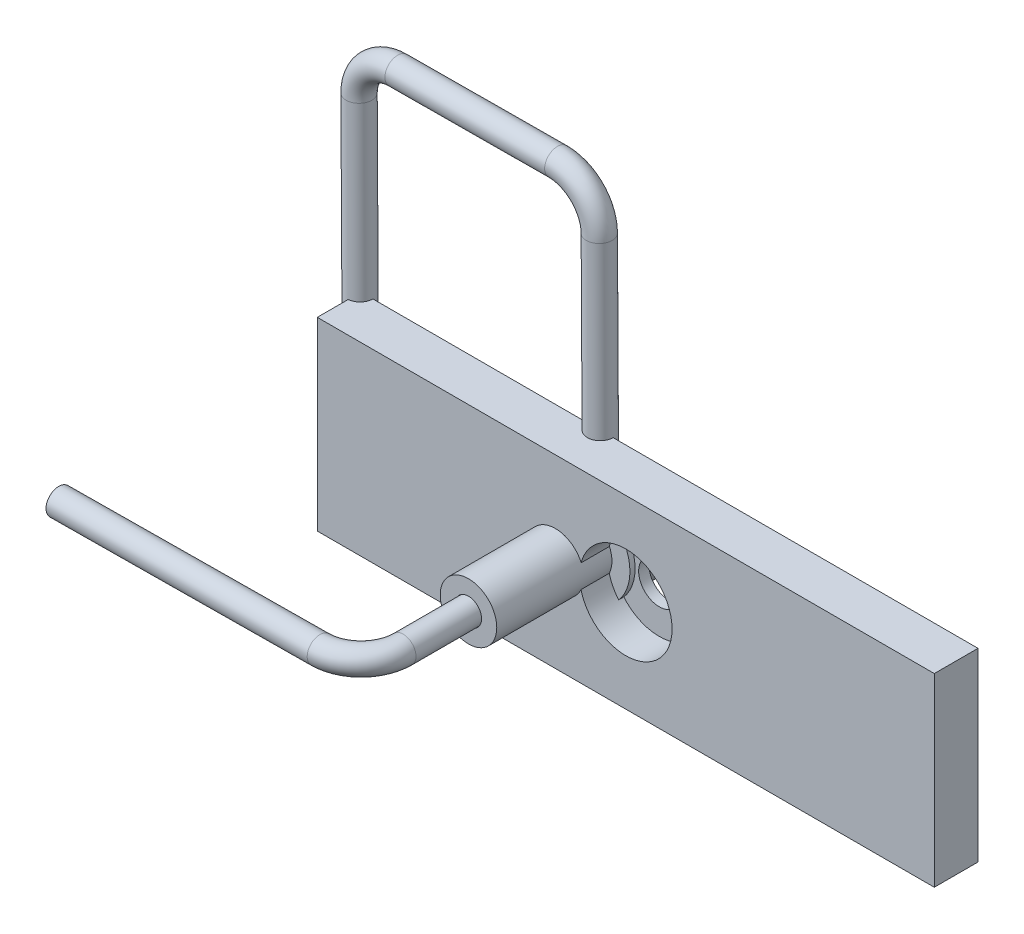
ISO-10303-21;
HEADER;
FILE_DESCRIPTION(('STEP AP214'),'2;1');
FILE_NAME('part.step','',(''),(''),'','','');
FILE_SCHEMA(('AUTOMOTIVE_DESIGN { 1 0 10303 214 1 1 1 1 }'));
ENDSEC;
DATA;
#1=APPLICATION_CONTEXT('core data for automotive mechanical design processes');
#2=APPLICATION_PROTOCOL_DEFINITION('international standard','automotive_design',2000,#1);
#3=PRODUCT_CONTEXT('',#1,'mechanical');
#4=PRODUCT('Part','Part','',(#3));
#5=PRODUCT_RELATED_PRODUCT_CATEGORY('part','',(#4));
#6=PRODUCT_DEFINITION_FORMATION('','',#4);
#7=PRODUCT_DEFINITION_CONTEXT('part definition',#1,'design');
#8=PRODUCT_DEFINITION('design','',#6,#7);
#9=PRODUCT_DEFINITION_SHAPE('','',#8);
#10=(LENGTH_UNIT() NAMED_UNIT(*) SI_UNIT(.MILLI.,.METRE.));
#11=(NAMED_UNIT(*) PLANE_ANGLE_UNIT() SI_UNIT($,.RADIAN.));
#12=(NAMED_UNIT(*) SI_UNIT($,.STERADIAN.) SOLID_ANGLE_UNIT());
#13=UNCERTAINTY_MEASURE_WITH_UNIT(LENGTH_MEASURE(1.E-05),#10,'distance_accuracy_value','');
#14=(GEOMETRIC_REPRESENTATION_CONTEXT(3) GLOBAL_UNCERTAINTY_ASSIGNED_CONTEXT((#13)) GLOBAL_UNIT_ASSIGNED_CONTEXT((#10,
#11,#12)) REPRESENTATION_CONTEXT('',''));
#15=CARTESIAN_POINT('',(0.,0.,0.));
#16=DIRECTION('',(0.,0.,1.));
#17=DIRECTION('',(1.,0.,0.));
#18=AXIS2_PLACEMENT_3D('',#15,#16,#17);
#19=CARTESIAN_POINT('',(0.,0.,18.));
#20=DIRECTION('',(0.,0.,1.));
#21=DIRECTION('',(1.,0.,0.));
#22=AXIS2_PLACEMENT_3D('',#19,#20,#21);
#23=PLANE('',#22);
#24=CARTESIAN_POINT('',(0.,0.,18.));
#25=DIRECTION('',(0.,0.,1.));
#26=DIRECTION('',(1.,0.,0.));
#27=AXIS2_PLACEMENT_3D('',#24,#25,#26);
#28=CIRCLE('',#27,5.);
#29=CARTESIAN_POINT('',(5.,0.,18.));
#30=VERTEX_POINT('',#29);
#31=EDGE_CURVE('E13',#30,#30,#28,.T.);
#32=ORIENTED_EDGE('',*,*,#31,.T.);
#33=EDGE_LOOP('',(#32));
#34=FACE_BOUND('',#33,.T.);
#35=CARTESIAN_POINT('',(0.,0.,18.));
#36=DIRECTION('',(0.,0.,1.));
#37=DIRECTION('',(1.,0.,0.));
#38=AXIS2_PLACEMENT_3D('',#35,#36,#37);
#39=CIRCLE('',#38,2.55);
#40=CARTESIAN_POINT('',(2.55,0.,18.));
#41=VERTEX_POINT('',#40);
#42=EDGE_CURVE('E159',#41,#41,#39,.T.);
#43=ORIENTED_EDGE('',*,*,#42,.F.);
#44=EDGE_LOOP('',(#43));
#45=FACE_BOUND('',#44,.T.);
#46=ADVANCED_FACE('F148',(#34,#45),#23,.T.);
#47=CARTESIAN_POINT('',(0.,0.,0.));
#48=DIRECTION('',(0.,0.,1.));
#49=DIRECTION('',(1.,0.,0.));
#50=AXIS2_PLACEMENT_3D('',#47,#48,#49);
#51=PLANE('',#50);
#52=CARTESIAN_POINT('',(0.,0.,0.));
#53=DIRECTION('',(0.,0.,1.));
#54=DIRECTION('',(1.,0.,0.));
#55=AXIS2_PLACEMENT_3D('',#52,#53,#54);
#56=CIRCLE('',#55,5.);
#57=CARTESIAN_POINT('',(5.,0.,0.));
#58=VERTEX_POINT('',#57);
#59=EDGE_CURVE('E152',#58,#58,#56,.T.);
#60=ORIENTED_EDGE('',*,*,#59,.F.);
#61=EDGE_LOOP('',(#60));
#62=FACE_BOUND('',#61,.T.);
#63=CARTESIAN_POINT('',(0.,0.,0.));
#64=DIRECTION('',(0.,0.,1.));
#65=DIRECTION('',(1.,0.,0.));
#66=AXIS2_PLACEMENT_3D('',#63,#64,#65);
#67=CIRCLE('',#66,2.55);
#68=CARTESIAN_POINT('',(2.55,0.,0.));
#69=VERTEX_POINT('',#68);
#70=EDGE_CURVE('E161',#69,#69,#67,.T.);
#71=ORIENTED_EDGE('',*,*,#70,.T.);
#72=EDGE_LOOP('',(#71));
#73=FACE_BOUND('',#72,.T.);
#74=ADVANCED_FACE('F171',(#62,#73),#51,.F.);
#75=CARTESIAN_POINT('',(0.,0.,18.));
#76=DIRECTION('',(0.,0.,-1.));
#77=DIRECTION('',(-1.,0.,0.));
#78=AXIS2_PLACEMENT_3D('',#75,#76,#77);
#79=CYLINDRICAL_SURFACE('',#78,5.);
#80=ORIENTED_EDGE('',*,*,#31,.F.);
#81=EDGE_LOOP('',(#80));
#82=FACE_BOUND('',#81,.T.);
#83=ORIENTED_EDGE('',*,*,#59,.T.);
#84=EDGE_LOOP('',(#83));
#85=FACE_BOUND('',#84,.T.);
#86=ADVANCED_FACE('F150',(#82,#85),#79,.T.);
#87=CARTESIAN_POINT('',(0.,0.,18.));
#88=DIRECTION('',(0.,0.,-1.));
#89=DIRECTION('',(-1.,0.,0.));
#90=AXIS2_PLACEMENT_3D('',#87,#88,#89);
#91=CYLINDRICAL_SURFACE('',#90,2.55);
#92=ORIENTED_EDGE('',*,*,#42,.T.);
#93=EDGE_LOOP('',(#92));
#94=FACE_BOUND('',#93,.T.);
#95=ORIENTED_EDGE('',*,*,#70,.F.);
#96=EDGE_LOOP('',(#95));
#97=FACE_BOUND('',#96,.T.);
#98=ADVANCED_FACE('F167',(#94,#97),#91,.F.);
#99=CLOSED_SHELL('',(#46,#74,#86,#98));
#100=MANIFOLD_SOLID_BREP('B2',#99);
#101=CARTESIAN_POINT('',(73.694582367874,0.,8.5));
#102=DIRECTION('',(-1.,0.,0.));
#103=DIRECTION('',(0.,0.,1.));
#104=AXIS2_PLACEMENT_3D('',#101,#102,#103);
#105=PLANE('',#104);
#106=DIRECTION('',(0.,1.,0.));
#107=VECTOR('',#106,1.);
#108=CARTESIAN_POINT('',(73.694582367874,0.,0.));
#109=LINE('',#108,#107);
#110=CARTESIAN_POINT('',(73.694582367874,-18.0858213584229,0.));
#111=VERTEX_POINT('',#110);
#112=CARTESIAN_POINT('',(73.694582367874,17.9141786415771,0.));
#113=VERTEX_POINT('',#112);
#114=EDGE_CURVE('E287',#111,#113,#109,.T.);
#115=ORIENTED_EDGE('',*,*,#114,.T.);
#116=DIRECTION('',(0.,0.,-1.));
#117=VECTOR('',#116,1.);
#118=CARTESIAN_POINT('',(73.694582367874,17.9141786415771,8.5));
#119=LINE('',#118,#117);
#120=CARTESIAN_POINT('',(73.694582367874,17.9141786415771,8.5));
#121=VERTEX_POINT('',#120);
#122=EDGE_CURVE('E225',#121,#113,#119,.T.);
#123=ORIENTED_EDGE('',*,*,#122,.F.);
#124=DIRECTION('',(0.,1.,0.));
#125=VECTOR('',#124,1.);
#126=CARTESIAN_POINT('',(73.694582367874,0.,8.5));
#127=LINE('',#126,#125);
#128=CARTESIAN_POINT('',(73.694582367874,-18.0858213584229,8.5));
#129=VERTEX_POINT('',#128);
#130=EDGE_CURVE('E258',#129,#121,#127,.T.);
#131=ORIENTED_EDGE('',*,*,#130,.F.);
#132=DIRECTION('',(0.,0.,-1.));
#133=VECTOR('',#132,1.);
#134=CARTESIAN_POINT('',(73.694582367874,-18.0858213584229,8.5));
#135=LINE('',#134,#133);
#136=EDGE_CURVE('E233',#129,#111,#135,.T.);
#137=ORIENTED_EDGE('',*,*,#136,.T.);
#138=EDGE_LOOP('',(#115,#123,#131,#137));
#139=FACE_BOUND('',#138,.T.);
#140=ADVANCED_FACE('F217',(#139),#105,.F.);
#141=CARTESIAN_POINT('',(0.,17.9141786415771,8.5));
#142=DIRECTION('',(0.,1.,0.));
#143=DIRECTION('',(0.,0.,1.));
#144=AXIS2_PLACEMENT_3D('',#141,#142,#143);
#145=PLANE('',#144);
#146=DIRECTION('',(1.,0.,0.));
#147=VECTOR('',#146,1.);
#148=CARTESIAN_POINT('',(0.,17.9141786415771,0.));
#149=LINE('',#148,#147);
#150=CARTESIAN_POINT('',(-46.305417632126,17.9141786415771,0.));
#151=VERTEX_POINT('',#150);
#152=EDGE_CURVE('E268',#151,#113,#149,.T.);
#153=ORIENTED_EDGE('',*,*,#152,.F.);
#154=DIRECTION('',(0.,0.,-1.));
#155=VECTOR('',#154,1.);
#156=CARTESIAN_POINT('',(-46.305417632126,17.9141786415771,8.5));
#157=LINE('',#156,#155);
#158=CARTESIAN_POINT('',(-46.305417632126,17.9141786415771,8.5));
#159=VERTEX_POINT('',#158);
#160=EDGE_CURVE('E264',#159,#151,#157,.T.);
#161=ORIENTED_EDGE('',*,*,#160,.F.);
#162=DIRECTION('',(1.,0.,0.));
#163=VECTOR('',#162,1.);
#164=CARTESIAN_POINT('',(0.,17.9141786415771,8.5));
#165=LINE('',#164,#163);
#166=EDGE_CURVE('E266',#159,#121,#165,.T.);
#167=ORIENTED_EDGE('',*,*,#166,.T.);
#168=ORIENTED_EDGE('',*,*,#122,.T.);
#169=EDGE_LOOP('',(#153,#161,#167,#168));
#170=FACE_BOUND('',#169,.T.);
#171=ADVANCED_FACE('F265',(#170),#145,.T.);
#172=CARTESIAN_POINT('',(-46.305417632126,0.,8.5));
#173=DIRECTION('',(-1.,0.,0.));
#174=DIRECTION('',(0.,0.,1.));
#175=AXIS2_PLACEMENT_3D('',#172,#173,#174);
#176=PLANE('',#175);
#177=DIRECTION('',(0.,1.,0.));
#178=VECTOR('',#177,1.);
#179=CARTESIAN_POINT('',(-46.305417632126,0.,0.));
#180=LINE('',#179,#178);
#181=CARTESIAN_POINT('',(-46.305417632126,-18.0858213584229,0.));
#182=VERTEX_POINT('',#181);
#183=EDGE_CURVE('E291',#182,#151,#180,.T.);
#184=ORIENTED_EDGE('',*,*,#183,.F.);
#185=DIRECTION('',(0.,0.,-1.));
#186=VECTOR('',#185,1.);
#187=CARTESIAN_POINT('',(-46.305417632126,-18.0858213584229,8.5));
#188=LINE('',#187,#186);
#189=CARTESIAN_POINT('',(-46.305417632126,-18.0858213584229,8.5));
#190=VERTEX_POINT('',#189);
#191=EDGE_CURVE('E247',#190,#182,#188,.T.);
#192=ORIENTED_EDGE('',*,*,#191,.F.);
#193=DIRECTION('',(0.,1.,0.));
#194=VECTOR('',#193,1.);
#195=CARTESIAN_POINT('',(-46.305417632126,0.,8.5));
#196=LINE('',#195,#194);
#197=EDGE_CURVE('E276',#190,#159,#196,.T.);
#198=ORIENTED_EDGE('',*,*,#197,.T.);
#199=ORIENTED_EDGE('',*,*,#160,.T.);
#200=EDGE_LOOP('',(#184,#192,#198,#199));
#201=FACE_BOUND('',#200,.T.);
#202=ADVANCED_FACE('F278',(#201),#176,.T.);
#203=CARTESIAN_POINT('',(0.,-18.0858213584229,8.5));
#204=DIRECTION('',(0.,-1.,0.));
#205=DIRECTION('',(1.,0.,0.));
#206=AXIS2_PLACEMENT_3D('',#203,#204,#205);
#207=PLANE('',#206);
#208=DIRECTION('',(-1.,0.,0.));
#209=VECTOR('',#208,1.);
#210=CARTESIAN_POINT('',(0.,-18.0858213584229,0.));
#211=LINE('',#210,#209);
#212=EDGE_CURVE('E293',#111,#182,#211,.T.);
#213=ORIENTED_EDGE('',*,*,#212,.F.);
#214=ORIENTED_EDGE('',*,*,#136,.F.);
#215=DIRECTION('',(-1.,0.,0.));
#216=VECTOR('',#215,1.);
#217=CARTESIAN_POINT('',(0.,-18.0858213584229,8.5));
#218=LINE('',#217,#216);
#219=EDGE_CURVE('E279',#129,#190,#218,.T.);
#220=ORIENTED_EDGE('',*,*,#219,.T.);
#221=ORIENTED_EDGE('',*,*,#191,.T.);
#222=EDGE_LOOP('',(#213,#214,#220,#221));
#223=FACE_BOUND('',#222,.T.);
#224=ADVANCED_FACE('F300',(#223),#207,.T.);
#225=CARTESIAN_POINT('',(13.694582367874,-0.0858213584228676,8.5));
#226=DIRECTION('',(0.,0.,-1.));
#227=DIRECTION('',(-1.,0.,0.));
#228=AXIS2_PLACEMENT_3D('',#225,#226,#227);
#229=CYLINDRICAL_SURFACE('',#228,9.);
#230=CARTESIAN_POINT('',(13.694582367874,-0.0858213584228676,2.));
#231=DIRECTION('',(0.,0.,1.));
#232=DIRECTION('',(1.,0.,0.));
#233=AXIS2_PLACEMENT_3D('',#230,#231,#232);
#234=CIRCLE('',#233,9.);
#235=CARTESIAN_POINT('',(22.694582367874,-0.0858213584228676,2.));
#236=VERTEX_POINT('',#235);
#237=EDGE_CURVE('E146',#236,#236,#234,.T.);
#238=ORIENTED_EDGE('',*,*,#237,.F.);
#239=EDGE_LOOP('',(#238));
#240=FACE_BOUND('',#239,.T.);
#241=CARTESIAN_POINT('',(13.694582367874,-0.0858213584228676,8.5));
#242=DIRECTION('',(0.,0.,1.));
#243=DIRECTION('',(1.,0.,0.));
#244=AXIS2_PLACEMENT_3D('',#241,#242,#243);
#245=CIRCLE('',#244,9.);
#246=CARTESIAN_POINT('',(22.694582367874,-0.0858213584228676,8.5));
#247=VERTEX_POINT('',#246);
#248=EDGE_CURVE('E281',#247,#247,#245,.T.);
#249=ORIENTED_EDGE('',*,*,#248,.T.);
#250=EDGE_LOOP('',(#249));
#251=FACE_BOUND('',#250,.T.);
#252=ADVANCED_FACE('F302',(#240,#251),#229,.F.);
#253=CARTESIAN_POINT('',(0.,0.,8.5));
#254=DIRECTION('',(0.,0.,1.));
#255=DIRECTION('',(1.,0.,0.));
#256=AXIS2_PLACEMENT_3D('',#253,#254,#255);
#257=PLANE('',#256);
#258=ORIENTED_EDGE('',*,*,#130,.T.);
#259=ORIENTED_EDGE('',*,*,#166,.F.);
#260=ORIENTED_EDGE('',*,*,#197,.F.);
#261=ORIENTED_EDGE('',*,*,#219,.F.);
#262=EDGE_LOOP('',(#258,#259,#260,#261));
#263=FACE_BOUND('',#262,.T.);
#264=ORIENTED_EDGE('',*,*,#248,.F.);
#265=EDGE_LOOP('',(#264));
#266=FACE_BOUND('',#265,.T.);
#267=ADVANCED_FACE('F274',(#263,#266),#257,.T.);
#268=CARTESIAN_POINT('',(0.,0.,0.));
#269=DIRECTION('',(0.,0.,1.));
#270=DIRECTION('',(1.,0.,0.));
#271=AXIS2_PLACEMENT_3D('',#268,#269,#270);
#272=PLANE('',#271);
#273=ORIENTED_EDGE('',*,*,#114,.F.);
#274=ORIENTED_EDGE('',*,*,#212,.T.);
#275=ORIENTED_EDGE('',*,*,#183,.T.);
#276=ORIENTED_EDGE('',*,*,#152,.T.);
#277=EDGE_LOOP('',(#273,#274,#275,#276));
#278=FACE_BOUND('',#277,.T.);
#279=CARTESIAN_POINT('',(13.694582367874,-0.0858213584228676,0.));
#280=DIRECTION('',(0.,0.,1.));
#281=DIRECTION('',(1.,0.,0.));
#282=AXIS2_PLACEMENT_3D('',#279,#280,#281);
#283=CIRCLE('',#282,4.);
#284=CARTESIAN_POINT('',(17.694582367874,-0.0858213584228676,0.));
#285=VERTEX_POINT('',#284);
#286=EDGE_CURVE('E388',#285,#285,#283,.T.);
#287=ORIENTED_EDGE('',*,*,#286,.T.);
#288=EDGE_LOOP('',(#287));
#289=FACE_BOUND('',#288,.T.);
#290=ADVANCED_FACE('F298',(#278,#289),#272,.F.);
#291=CARTESIAN_POINT('',(13.694582367874,-0.0858213584228676,2.));
#292=DIRECTION('',(0.,0.,-1.));
#293=DIRECTION('',(-1.,0.,0.));
#294=AXIS2_PLACEMENT_3D('',#291,#292,#293);
#295=CYLINDRICAL_SURFACE('',#294,4.);
#296=CARTESIAN_POINT('',(13.694582367874,-0.0858213584228676,2.));
#297=DIRECTION('',(0.,0.,1.));
#298=DIRECTION('',(1.,0.,0.));
#299=AXIS2_PLACEMENT_3D('',#296,#297,#298);
#300=CIRCLE('',#299,4.);
#301=CARTESIAN_POINT('',(17.694582367874,-0.0858213584228676,2.));
#302=VERTEX_POINT('',#301);
#303=EDGE_CURVE('E289',#302,#302,#300,.T.);
#304=ORIENTED_EDGE('',*,*,#303,.T.);
#305=EDGE_LOOP('',(#304));
#306=FACE_BOUND('',#305,.T.);
#307=ORIENTED_EDGE('',*,*,#286,.F.);
#308=EDGE_LOOP('',(#307));
#309=FACE_BOUND('',#308,.T.);
#310=ADVANCED_FACE('F351',(#306,#309),#295,.F.);
#311=CARTESIAN_POINT('',(0.,0.,2.));
#312=DIRECTION('',(0.,0.,1.));
#313=DIRECTION('',(1.,0.,0.));
#314=AXIS2_PLACEMENT_3D('',#311,#312,#313);
#315=PLANE('',#314);
#316=ORIENTED_EDGE('',*,*,#237,.T.);
#317=EDGE_LOOP('',(#316));
#318=FACE_BOUND('',#317,.T.);
#319=ORIENTED_EDGE('',*,*,#303,.F.);
#320=EDGE_LOOP('',(#319));
#321=FACE_BOUND('',#320,.T.);
#322=ADVANCED_FACE('F361',(#318,#321),#315,.T.);
#323=CLOSED_SHELL('',(#140,#171,#202,#224,#252,#267,#290,#310,#322));
#324=MANIFOLD_SOLID_BREP('B8_NOT_SHOWN',#323);
#325=CARTESIAN_POINT('',(0.,0.,0.));
#326=DIRECTION('',(0.,0.,1.));
#327=DIRECTION('',(1.,0.,0.));
#328=AXIS2_PLACEMENT_3D('',#325,#326,#327);
#329=PLANE('',#328);
#330=CARTESIAN_POINT('',(0.,0.,0.));
#331=DIRECTION('',(0.,0.,1.));
#332=DIRECTION('',(1.,0.,0.));
#333=AXIS2_PLACEMENT_3D('',#330,#331,#332);
#334=CIRCLE('',#333,2.55);
#335=CARTESIAN_POINT('',(2.55,0.,0.));
#336=VERTEX_POINT('',#335);
#337=EDGE_CURVE('E448',#336,#336,#334,.T.);
#338=ORIENTED_EDGE('',*,*,#337,.T.);
#339=EDGE_LOOP('',(#338));
#340=FACE_BOUND('',#339,.T.);
#341=CARTESIAN_POINT('',(0.,0.,0.));
#342=DIRECTION('',(0.,0.,1.));
#343=DIRECTION('',(1.,0.,0.));
#344=AXIS2_PLACEMENT_3D('',#341,#342,#343);
#345=CIRCLE('',#344,7.05);
#346=CARTESIAN_POINT('',(7.05,0.,0.));
#347=VERTEX_POINT('',#346);
#348=EDGE_CURVE('E216',#347,#347,#345,.T.);
#349=ORIENTED_EDGE('',*,*,#348,.F.);
#350=EDGE_LOOP('',(#349));
#351=FACE_BOUND('',#350,.T.);
#352=ADVANCED_FACE('F432',(#340,#351),#329,.F.);
#353=CARTESIAN_POINT('',(0.,0.,25.4));
#354=DIRECTION('',(0.,0.,-1.));
#355=DIRECTION('',(-1.,0.,0.));
#356=AXIS2_PLACEMENT_3D('',#353,#354,#355);
#357=CYLINDRICAL_SURFACE('',#356,2.55);
#358=CARTESIAN_POINT('',(0.,0.,25.4));
#359=DIRECTION('',(0.,0.,1.));
#360=DIRECTION('',(1.,0.,0.));
#361=AXIS2_PLACEMENT_3D('',#358,#359,#360);
#362=CIRCLE('',#361,2.55);
#363=CARTESIAN_POINT('',(2.55,0.,25.4));
#364=VERTEX_POINT('',#363);
#365=EDGE_CURVE('E443',#364,#364,#362,.T.);
#366=ORIENTED_EDGE('',*,*,#365,.T.);
#367=EDGE_LOOP('',(#366));
#368=FACE_BOUND('',#367,.T.);
#369=ORIENTED_EDGE('',*,*,#337,.F.);
#370=EDGE_LOOP('',(#369));
#371=FACE_BOUND('',#370,.T.);
#372=ADVANCED_FACE('F434',(#368,#371),#357,.F.);
#373=CARTESIAN_POINT('',(0.,0.,25.4));
#374=DIRECTION('',(0.,0.,-1.));
#375=DIRECTION('',(-1.,0.,0.));
#376=AXIS2_PLACEMENT_3D('',#373,#374,#375);
#377=CYLINDRICAL_SURFACE('',#376,5.5);
#378=CARTESIAN_POINT('',(0.,0.,3.));
#379=DIRECTION('',(0.,0.,1.));
#380=DIRECTION('',(1.,0.,0.));
#381=AXIS2_PLACEMENT_3D('',#378,#379,#380);
#382=CIRCLE('',#381,5.5);
#383=CARTESIAN_POINT('',(5.5,0.,3.));
#384=VERTEX_POINT('',#383);
#385=EDGE_CURVE('E456',#384,#384,#382,.T.);
#386=ORIENTED_EDGE('',*,*,#385,.T.);
#387=EDGE_LOOP('',(#386));
#388=FACE_BOUND('',#387,.T.);
#389=CARTESIAN_POINT('',(0.,0.,25.4));
#390=DIRECTION('',(0.,0.,1.));
#391=DIRECTION('',(1.,0.,0.));
#392=AXIS2_PLACEMENT_3D('',#389,#390,#391);
#393=CIRCLE('',#392,5.5);
#394=CARTESIAN_POINT('',(5.5,0.,25.4));
#395=VERTEX_POINT('',#394);
#396=EDGE_CURVE('E439',#395,#395,#393,.T.);
#397=ORIENTED_EDGE('',*,*,#396,.F.);
#398=EDGE_LOOP('',(#397));
#399=FACE_BOUND('',#398,.T.);
#400=ADVANCED_FACE('F489',(#388,#399),#377,.T.);
#401=CARTESIAN_POINT('',(0.,0.,25.4));
#402=DIRECTION('',(0.,0.,1.));
#403=DIRECTION('',(1.,0.,0.));
#404=AXIS2_PLACEMENT_3D('',#401,#402,#403);
#405=PLANE('',#404);
#406=ORIENTED_EDGE('',*,*,#365,.F.);
#407=EDGE_LOOP('',(#406));
#408=FACE_BOUND('',#407,.T.);
#409=ORIENTED_EDGE('',*,*,#396,.T.);
#410=EDGE_LOOP('',(#409));
#411=FACE_BOUND('',#410,.T.);
#412=ADVANCED_FACE('F493',(#408,#411),#405,.T.);
#413=CARTESIAN_POINT('',(0.,0.,3.));
#414=DIRECTION('',(0.,0.,-1.));
#415=DIRECTION('',(-1.,0.,0.));
#416=AXIS2_PLACEMENT_3D('',#413,#414,#415);
#417=CYLINDRICAL_SURFACE('',#416,9.);
#418=CARTESIAN_POINT('',(0.,0.,3.));
#419=DIRECTION('',(0.,0.,1.));
#420=DIRECTION('',(1.,0.,0.));
#421=AXIS2_PLACEMENT_3D('',#418,#419,#420);
#422=CIRCLE('',#421,9.);
#423=CARTESIAN_POINT('',(9.,0.,3.));
#424=VERTEX_POINT('',#423);
#425=EDGE_CURVE('E452',#424,#424,#422,.T.);
#426=ORIENTED_EDGE('',*,*,#425,.F.);
#427=EDGE_LOOP('',(#426));
#428=FACE_BOUND('',#427,.T.);
#429=CARTESIAN_POINT('',(0.,0.,-6.25));
#430=DIRECTION('',(0.,0.,1.));
#431=DIRECTION('',(1.,0.,0.));
#432=AXIS2_PLACEMENT_3D('',#429,#430,#431);
#433=CIRCLE('',#432,9.);
#434=CARTESIAN_POINT('',(9.,0.,-6.25));
#435=VERTEX_POINT('',#434);
#436=EDGE_CURVE('E460',#435,#435,#433,.T.);
#437=ORIENTED_EDGE('',*,*,#436,.T.);
#438=EDGE_LOOP('',(#437));
#439=FACE_BOUND('',#438,.T.);
#440=ADVANCED_FACE('F481',(#428,#439),#417,.T.);
#441=CARTESIAN_POINT('',(0.,0.,3.));
#442=DIRECTION('',(0.,0.,1.));
#443=DIRECTION('',(1.,0.,0.));
#444=AXIS2_PLACEMENT_3D('',#441,#442,#443);
#445=PLANE('',#444);
#446=ORIENTED_EDGE('',*,*,#385,.F.);
#447=EDGE_LOOP('',(#446));
#448=FACE_BOUND('',#447,.T.);
#449=ORIENTED_EDGE('',*,*,#425,.T.);
#450=EDGE_LOOP('',(#449));
#451=FACE_BOUND('',#450,.T.);
#452=ADVANCED_FACE('F474',(#448,#451),#445,.T.);
#453=CARTESIAN_POINT('',(0.,0.,-6.25));
#454=DIRECTION('',(0.,0.,1.));
#455=DIRECTION('',(1.,0.,0.));
#456=AXIS2_PLACEMENT_3D('',#453,#454,#455);
#457=CYLINDRICAL_SURFACE('',#456,7.05);
#458=CARTESIAN_POINT('',(0.,0.,-6.25));
#459=DIRECTION('',(0.,0.,1.));
#460=DIRECTION('',(1.,0.,0.));
#461=AXIS2_PLACEMENT_3D('',#458,#459,#460);
#462=CIRCLE('',#461,7.05);
#463=CARTESIAN_POINT('',(7.05,0.,-6.25));
#464=VERTEX_POINT('',#463);
#465=EDGE_CURVE('E465',#464,#464,#462,.T.);
#466=ORIENTED_EDGE('',*,*,#465,.F.);
#467=EDGE_LOOP('',(#466));
#468=FACE_BOUND('',#467,.T.);
#469=ORIENTED_EDGE('',*,*,#348,.T.);
#470=EDGE_LOOP('',(#469));
#471=FACE_BOUND('',#470,.T.);
#472=ADVANCED_FACE('F472',(#468,#471),#457,.F.);
#473=CARTESIAN_POINT('',(0.,0.,-6.25));
#474=DIRECTION('',(0.,0.,1.));
#475=DIRECTION('',(1.,0.,0.));
#476=AXIS2_PLACEMENT_3D('',#473,#474,#475);
#477=PLANE('',#476);
#478=ORIENTED_EDGE('',*,*,#465,.T.);
#479=EDGE_LOOP('',(#478));
#480=FACE_BOUND('',#479,.T.);
#481=ORIENTED_EDGE('',*,*,#436,.F.);
#482=EDGE_LOOP('',(#481));
#483=FACE_BOUND('',#482,.T.);
#484=ADVANCED_FACE('F469',(#480,#483),#477,.F.);
#485=CLOSED_SHELL('',(#352,#372,#400,#412,#440,#452,#472,#484));
#486=MANIFOLD_SOLID_BREP('B140_NOT_SHOWN',#485);
#487=CARTESIAN_POINT('',(0.,0.,101.6));
#488=DIRECTION('',(0.,0.,-1.));
#489=DIRECTION('',(-1.,0.,0.));
#490=AXIS2_PLACEMENT_3D('',#487,#488,#489);
#491=CYLINDRICAL_SURFACE('',#490,2.5);
#492=CARTESIAN_POINT('',(0.,0.,0.));
#493=DIRECTION('',(0.,0.,1.));
#494=DIRECTION('',(1.,0.,0.));
#495=AXIS2_PLACEMENT_3D('',#492,#493,#494);
#496=CIRCLE('',#495,2.5);
#497=CARTESIAN_POINT('',(2.5,0.,0.));
#498=VERTEX_POINT('',#497);
#499=EDGE_CURVE('E585',#498,#498,#496,.T.);
#500=ORIENTED_EDGE('',*,*,#499,.T.);
#501=EDGE_LOOP('',(#500));
#502=FACE_BOUND('',#501,.T.);
#503=CARTESIAN_POINT('',(0.,0.,38.1));
#504=DIRECTION('',(0.,0.,1.));
#505=DIRECTION('',(1.,0.,0.));
#506=AXIS2_PLACEMENT_3D('',#503,#504,#505);
#507=CIRCLE('',#506,2.5);
#508=CARTESIAN_POINT('',(2.49990480766043,0.0218163387459008,38.1));
#509=VERTEX_POINT('',#508);
#510=EDGE_CURVE('E580',#509,#509,#507,.T.);
#511=ORIENTED_EDGE('',*,*,#510,.F.);
#512=EDGE_LOOP('',(#511));
#513=FACE_BOUND('',#512,.T.);
#514=ADVANCED_FACE('F572',(#502,#513),#491,.T.);
#515=CARTESIAN_POINT('',(-8.08476325433448,-0.0705546600400517,38.1));
#516=DIRECTION('',(0.00872653549836032,-0.999961923064171,0.));
#517=DIRECTION('',(0.999961923064171,0.00872653549836032,0.));
#518=AXIS2_PLACEMENT_3D('',#515,#516,#517);
#519=TOROIDAL_SURFACE('',#518,8.08507110906827,2.5);
#520=CARTESIAN_POINT('',(-8.08476325433451,-0.0705546600400519,46.1850711090683));
#521=DIRECTION('',(-0.999961923064171,-0.00872653549836032,0.));
#522=DIRECTION('',(7.61524218006515E-05,-0.00872620321862817,0.999961923064171));
#523=AXIS2_PLACEMENT_3D('',#520,#521,#522);
#524=CIRCLE('',#523,2.5);
#525=CARTESIAN_POINT('',(-8.08476325433451,-0.070554660040052,48.6850711090683));
#526=VERTEX_POINT('',#525);
#527=EDGE_CURVE('E431',#526,#526,#524,.T.);
#528=CARTESIAN_POINT('',(-8.08476325433448,-0.0705546600400517,38.1));
#529=DIRECTION('',(0.00872653549836032,-0.999961923064171,0.));
#530=DIRECTION('',(0.999961923064171,0.00872653549836032,0.));
#531=AXIS2_PLACEMENT_3D('',#528,#529,#530);
#532=CIRCLE('',#531,10.5850711090683);
#533=EDGE_CURVE('',#509,#526,#532,.T.);
#534=ORIENTED_EDGE('',*,*,#510,.T.);
#535=ORIENTED_EDGE('',*,*,#527,.F.);
#536=ORIENTED_EDGE('',*,*,#533,.T.);
#537=ORIENTED_EDGE('',*,*,#533,.F.);
#538=EDGE_LOOP('',(#534,#536,#535,#537));
#539=FACE_BOUND('',#538,.T.);
#540=ADVANCED_FACE('F605',(#539),#519,.T.);
#541=CARTESIAN_POINT('',(-58.8828289459944,-0.513862663356756,46.1850711090681));
#542=DIRECTION('',(0.999961923064171,0.00872653549836032,0.));
#543=DIRECTION('',(-7.61524218006515E-05,0.00872620321862817,-0.999961923064171));
#544=AXIS2_PLACEMENT_3D('',#541,#542,#543);
#545=CYLINDRICAL_SURFACE('',#544,2.5);
#546=ORIENTED_EDGE('',*,*,#527,.T.);
#547=EDGE_LOOP('',(#546));
#548=FACE_BOUND('',#547,.T.);
#549=CARTESIAN_POINT('',(-58.8828289459944,-0.513862663356756,46.1850711090681));
#550=DIRECTION('',(-0.999961923064171,-0.00872653549836032,0.));
#551=DIRECTION('',(7.61524218006515E-05,-0.00872620321862817,0.999961923064171));
#552=AXIS2_PLACEMENT_3D('',#549,#550,#551);
#553=CIRCLE('',#552,2.5);
#554=CARTESIAN_POINT('',(-58.8826385649399,-0.535678171403326,48.6849759167285));
#555=VERTEX_POINT('',#554);
#556=EDGE_CURVE('E588',#555,#555,#553,.T.);
#557=ORIENTED_EDGE('',*,*,#556,.F.);
#558=EDGE_LOOP('',(#557));
#559=FACE_BOUND('',#558,.T.);
#560=ADVANCED_FACE('F602',(#548,#559),#545,.T.);
#561=CARTESIAN_POINT('',(-58.8828289459944,-0.513862663356756,46.1850711090681));
#562=DIRECTION('',(-0.999961923064171,-0.00872653549836032,0.));
#563=DIRECTION('',(7.61524218006515E-05,-0.00872620321862817,0.999961923064171));
#564=AXIS2_PLACEMENT_3D('',#561,#562,#563);
#565=PLANE('',#564);
#566=ORIENTED_EDGE('',*,*,#556,.T.);
#567=EDGE_LOOP('',(#566));
#568=FACE_BOUND('',#567,.T.);
#569=ADVANCED_FACE('F598',(#568),#565,.T.);
#570=CARTESIAN_POINT('',(0.,0.,0.));
#571=DIRECTION('',(0.,0.,1.));
#572=DIRECTION('',(1.,0.,0.));
#573=AXIS2_PLACEMENT_3D('',#570,#571,#572);
#574=PLANE('',#573);
#575=ORIENTED_EDGE('',*,*,#499,.F.);
#576=EDGE_LOOP('',(#575));
#577=FACE_BOUND('',#576,.T.);
#578=ADVANCED_FACE('F574',(#577),#574,.F.);
#579=CLOSED_SHELL('',(#514,#540,#560,#569,#578));
#580=MANIFOLD_SOLID_BREP('B211_NOT_SHOWN',#579);
#581=CARTESIAN_POINT('',(-46.420753356991,4.59161939468769,-1.76544371842712E-13));
#582=DIRECTION('',(-0.00563734568943531,0.999984110040543,0.));
#583=DIRECTION('',(0.,0.,-1.));
#584=AXIS2_PLACEMENT_3D('',#581,#582,#583);
#585=CYLINDRICAL_SURFACE('',#584,2.5);
#586=CARTESIAN_POINT('',(-46.6839243014587,51.2743628683252,0.));
#587=DIRECTION('',(-0.00563734568943116,0.999984110040544,0.));
#588=DIRECTION('',(0.,0.,-1.));
#589=AXIS2_PLACEMENT_3D('',#586,#587,#588);
#590=CIRCLE('',#589,2.5);
#591=CARTESIAN_POINT('',(-46.6839243014588,51.2743628683252,-2.50000000000001));
#592=VERTEX_POINT('',#591);
#593=EDGE_CURVE('E571',#592,#592,#590,.T.);
#594=ORIENTED_EDGE('',*,*,#593,.F.);
#595=EDGE_LOOP('',(#594));
#596=FACE_BOUND('',#595,.T.);
#597=CARTESIAN_POINT('',(-46.420753356991,4.59161939468769,-1.76544371842712E-13));
#598=DIRECTION('',(0.00563734568943531,-0.999984110040544,0.));
#599=DIRECTION('',(0.,0.,1.));
#600=AXIS2_PLACEMENT_3D('',#597,#598,#599);
#601=CIRCLE('',#600,2.5);
#602=CARTESIAN_POINT('',(-46.420753356991,4.59161939468768,2.49999999999982));
#603=VERTEX_POINT('',#602);
#604=EDGE_CURVE('E674',#603,#603,#601,.T.);
#605=ORIENTED_EDGE('',*,*,#604,.F.);
#606=EDGE_LOOP('',(#605));
#607=FACE_BOUND('',#606,.T.);
#608=ADVANCED_FACE('F646',(#596,#607),#585,.T.);
#609=CARTESIAN_POINT('',(-8.04265016746616,50.9751657825808,0.));
#610=DIRECTION('',(0.,0.,1.));
#611=DIRECTION('',(0.999984110040544,0.00563734568942783,0.));
#612=AXIS2_PLACEMENT_3D('',#609,#610,#611);
#613=TOROIDAL_SURFACE('',#612,8.08507110906829,2.5);
#614=CARTESIAN_POINT('',(-8.08822850823162,59.0601084201969,0.));
#615=DIRECTION('',(-0.999984110040544,-0.00563734568943199,0.));
#616=DIRECTION('',(0.,0.,1.));
#617=AXIS2_PLACEMENT_3D('',#614,#615,#616);
#618=CIRCLE('',#617,2.5);
#619=CARTESIAN_POINT('',(-8.08822850823162,59.0601084201969,2.5));
#620=VERTEX_POINT('',#619);
#621=EDGE_CURVE('E659',#620,#620,#618,.T.);
#622=ORIENTED_EDGE('',*,*,#621,.F.);
#623=EDGE_LOOP('',(#622));
#624=FACE_BOUND('',#623,.T.);
#625=CARTESIAN_POINT('',(0.0422924701500044,51.0207441233462,0.));
#626=DIRECTION('',(-0.00563734568942783,0.999984110040544,0.));
#627=DIRECTION('',(0.,0.,1.));
#628=AXIS2_PLACEMENT_3D('',#625,#626,#627);
#629=CIRCLE('',#628,2.5);
#630=CARTESIAN_POINT('',(0.0422924701500042,51.0207441233462,-2.5));
#631=VERTEX_POINT('',#630);
#632=EDGE_CURVE('E671',#631,#631,#629,.T.);
#633=ORIENTED_EDGE('',*,*,#632,.T.);
#634=EDGE_LOOP('',(#633));
#635=FACE_BOUND('',#634,.T.);
#636=ADVANCED_FACE('F686',(#624,#635),#613,.T.);
#637=CARTESIAN_POINT('',(-0.530461851895863,152.619129703465,0.));
#638=DIRECTION('',(0.00563734568942783,-0.999984110040543,0.));
#639=DIRECTION('',(0.,0.,-1.));
#640=AXIS2_PLACEMENT_3D('',#637,#638,#639);
#641=CYLINDRICAL_SURFACE('',#640,2.5);
#642=CARTESIAN_POINT('',(0.328669631172938,0.221551333286567,0.));
#643=DIRECTION('',(-0.00563734568942783,0.999984110040544,0.));
#644=DIRECTION('',(0.,0.,1.));
#645=AXIS2_PLACEMENT_3D('',#642,#643,#644);
#646=CIRCLE('',#645,2.5);
#647=CARTESIAN_POINT('',(0.328669631172938,0.221551333286552,-2.5));
#648=VERTEX_POINT('',#647);
#649=EDGE_CURVE('E668',#648,#648,#646,.T.);
#650=CARTESIAN_POINT('',(0.328669631172938,0.221551333286552,-2.5));
#651=CARTESIAN_POINT('',(0.325686535745616,0.750709591516342,-2.5));
#652=CARTESIAN_POINT('',(0.322703440318294,1.27986784974613,-2.5));
#653=CARTESIAN_POINT('',(0.316737249463649,2.33818436620572,-2.5));
#654=CARTESIAN_POINT('',(0.313754154036327,2.86734262443551,-2.5));
#655=CARTESIAN_POINT('',(0.307787963181683,3.92565914089508,-2.5));
#656=CARTESIAN_POINT('',(0.30480486775436,4.45481739912486,-2.5));
#657=CARTESIAN_POINT('',(0.298838676899716,5.51313391558444,-2.5));
#658=CARTESIAN_POINT('',(0.295855581472394,6.04229217381423,-2.5));
#659=CARTESIAN_POINT('',(0.289889390617749,7.10060869027381,-2.5));
#660=CARTESIAN_POINT('',(0.286906295190427,7.6297669485036,-2.5));
#661=CARTESIAN_POINT('',(0.280940104335783,8.68808346496317,-2.5));
#662=CARTESIAN_POINT('',(0.27795700890846,9.21724172319296,-2.5));
#663=CARTESIAN_POINT('',(0.271990818053816,10.2755582396525,-2.5));
#664=CARTESIAN_POINT('',(0.269007722626494,10.8047164978823,-2.5));
#665=CARTESIAN_POINT('',(0.263041531771849,11.8630330143419,-2.5));
#666=CARTESIAN_POINT('',(0.260058436344527,12.3921912725717,-2.5));
#667=CARTESIAN_POINT('',(0.254092245489882,13.4505077890313,-2.5));
#668=CARTESIAN_POINT('',(0.25110915006256,13.979666047261,-2.5));
#669=CARTESIAN_POINT('',(0.245142959207916,15.0379825637206,-2.5));
#670=CARTESIAN_POINT('',(0.242159863780594,15.5671408219504,-2.5));
#671=CARTESIAN_POINT('',(0.236193672925949,16.62545733841,-2.5));
#672=CARTESIAN_POINT('',(0.233210577498627,17.1546155966398,-2.5));
#673=CARTESIAN_POINT('',(0.227244386643982,18.2129321130994,-2.5));
#674=CARTESIAN_POINT('',(0.22426129121666,18.7420903713291,-2.5));
#675=CARTESIAN_POINT('',(0.218295100362016,19.8004068877887,-2.5));
#676=CARTESIAN_POINT('',(0.215312004934693,20.3295651460185,-2.5));
#677=CARTESIAN_POINT('',(0.209345814080049,21.3878816624781,-2.5));
#678=CARTESIAN_POINT('',(0.206362718652727,21.9170399207079,-2.5));
#679=CARTESIAN_POINT('',(0.200396527798082,22.9753564371675,-2.5));
#680=CARTESIAN_POINT('',(0.19741343237076,23.5045146953972,-2.5));
#681=CARTESIAN_POINT('',(0.191447241516116,24.5628312118568,-2.5));
#682=CARTESIAN_POINT('',(0.188464146088793,25.0919894700866,-2.5));
#683=CARTESIAN_POINT('',(0.182497955234149,26.1503059865462,-2.5));
#684=CARTESIAN_POINT('',(0.179514859806827,26.679464244776,-2.5));
#685=CARTESIAN_POINT('',(0.173548668952182,27.7377807612355,-2.5));
#686=CARTESIAN_POINT('',(0.17056557352486,28.2669390194653,-2.5));
#687=CARTESIAN_POINT('',(0.164599382670216,29.3252555359249,-2.5));
#688=CARTESIAN_POINT('',(0.161616287242893,29.8544137941547,-2.5));
#689=CARTESIAN_POINT('',(0.155650096388249,30.9127303106143,-2.5));
#690=CARTESIAN_POINT('',(0.152667000960927,31.441888568844,-2.5));
#691=CARTESIAN_POINT('',(0.146700810106282,32.5002050853036,-2.5));
#692=CARTESIAN_POINT('',(0.14371771467896,33.0293633435334,-2.5));
#693=CARTESIAN_POINT('',(0.137751523824316,34.087679859993,-2.5));
#694=CARTESIAN_POINT('',(0.134768428396993,34.6168381182228,-2.5));
#695=CARTESIAN_POINT('',(0.128802237542349,35.6751546346824,-2.5));
#696=CARTESIAN_POINT('',(0.125819142115027,36.2043128929121,-2.5));
#697=CARTESIAN_POINT('',(0.119852951260382,37.2626294093717,-2.5));
#698=CARTESIAN_POINT('',(0.11686985583306,37.7917876676015,-2.5));
#699=CARTESIAN_POINT('',(0.110903664978415,38.8501041840611,-2.5));
#700=CARTESIAN_POINT('',(0.107920569551093,39.3792624422909,-2.5));
#701=CARTESIAN_POINT('',(0.101954378696449,40.4375789587504,-2.5));
#702=CARTESIAN_POINT('',(0.0989712832691266,40.9667372169802,-2.5));
#703=CARTESIAN_POINT('',(0.0930050924144822,42.0250537334398,-2.5));
#704=CARTESIAN_POINT('',(0.09002199698716,42.5542119916696,-2.5));
#705=CARTESIAN_POINT('',(0.0840558061325155,43.6125285081292,-2.5));
#706=CARTESIAN_POINT('',(0.0810727107051932,44.141686766359,-2.5));
#707=CARTESIAN_POINT('',(0.0751065198505488,45.2000032828185,-2.5));
#708=CARTESIAN_POINT('',(0.0721234244232265,45.7291615410483,-2.5));
#709=CARTESIAN_POINT('',(0.0661572335685821,46.7874780575079,-2.5));
#710=CARTESIAN_POINT('',(0.0631741381412599,47.3166363157377,-2.5));
#711=CARTESIAN_POINT('',(0.0572079472866154,48.3749528321973,-2.5));
#712=CARTESIAN_POINT('',(0.0542248518592931,48.9041110904271,-2.5));
#713=CARTESIAN_POINT('',(0.0482586610046486,49.9624276068866,-2.5));
#714=CARTESIAN_POINT('',(0.0452755655773264,50.4915858651164,-2.5));
#715=CARTESIAN_POINT('',(0.0422924701500042,51.0207441233462,-2.5));
#716=B_SPLINE_CURVE_WITH_KNOTS('',3,(#650,#651,#652,#653,#654,#655,#656,#657,#658,#659,#660,
#661,#662,#663,#664,#665,#666,#667,#668,#669,#670,#671,#672,#673,#674,#675,#676,#677,#678,#679,
#680,#681,#682,#683,#684,#685,#686,#687,#688,#689,#690,#691,#692,#693,#694,#695,#696,#697,#698,
#699,#700,#701,#702,#703,#704,#705,#706,#707,#708,#709,#710,#711,#712,#713,#714,#715),
.UNSPECIFIED.,.F.,.F.,(4,2,2,2,2,2,2,2,2,2,2,2,2,2,2,2,2,2,2,2,2,2,2,2,2,2,2,2,2,2,2,2,4),(0.,
1.58750000000001,3.17500000000002,4.7625,6.35000000000002,7.93750000000003,9.52500000000001,
11.1125,12.7,14.2875,15.875,17.4625,19.05,20.6375,22.225,23.8125,25.4,26.9875000000001,28.575,
30.1625,31.75,33.3375,34.925,36.5125000000001,38.1000000000001,39.6875000000001,
41.2750000000001,42.8625000000001,44.4500000000001,46.0375000000001,47.6250000000001,
49.2125000000001,50.8000000000001),.UNSPECIFIED.);
#717=EDGE_CURVE('BSEAM692',#648,#631,#716,.T.);
#718=ORIENTED_EDGE('',*,*,#649,.T.);
#719=ORIENTED_EDGE('',*,*,#632,.F.);
#720=ORIENTED_EDGE('',*,*,#717,.T.);
#721=ORIENTED_EDGE('',*,*,#717,.F.);
#722=EDGE_LOOP('',(#718,#720,#719,#721));
#723=FACE_BOUND('',#722,.T.);
#724=ADVANCED_FACE('F692',(#723),#641,.T.);
#725=CARTESIAN_POINT('',(-39.116,51.3170265516882,-2.02048781873498E-13));
#726=DIRECTION('',(0.,0.,-1.));
#727=DIRECTION('',(0.,1.,0.));
#728=AXIS2_PLACEMENT_3D('',#725,#726,#727);
#729=TOROIDAL_SURFACE('',#728,7.56804455737974,2.5);
#730=CARTESIAN_POINT('',(-39.1586636833629,58.884950853147,0.));
#731=DIRECTION('',(0.999984110040544,0.00563734568942783,0.));
#732=DIRECTION('',(0.,0.,-1.));
#733=AXIS2_PLACEMENT_3D('',#730,#731,#732);
#734=CIRCLE('',#733,2.5);
#735=CARTESIAN_POINT('',(-39.1586636833629,58.884950853147,-2.5));
#736=VERTEX_POINT('',#735);
#737=EDGE_CURVE('E654',#736,#736,#734,.T.);
#738=ORIENTED_EDGE('',*,*,#737,.F.);
#739=EDGE_LOOP('',(#738));
#740=FACE_BOUND('',#739,.T.);
#741=ORIENTED_EDGE('',*,*,#593,.T.);
#742=EDGE_LOOP('',(#741));
#743=FACE_BOUND('',#742,.T.);
#744=ADVANCED_FACE('F698',(#740,#743),#729,.T.);
#745=CARTESIAN_POINT('',(-96.9868158908359,58.5589483884064,0.));
#746=DIRECTION('',(0.999984110040543,0.00563734568943199,0.));
#747=DIRECTION('',(0.,0.,-1.));
#748=AXIS2_PLACEMENT_3D('',#745,#746,#747);
#749=CYLINDRICAL_SURFACE('',#748,2.5);
#750=ORIENTED_EDGE('',*,*,#621,.T.);
#751=EDGE_LOOP('',(#750));
#752=FACE_BOUND('',#751,.T.);
#753=ORIENTED_EDGE('',*,*,#737,.T.);
#754=EDGE_LOOP('',(#753));
#755=FACE_BOUND('',#754,.T.);
#756=ADVANCED_FACE('F702',(#752,#755),#749,.T.);
#757=CARTESIAN_POINT('',(-46.420753356991,4.59161939468769,-1.76544371842712E-13));
#758=DIRECTION('',(0.00563734568943531,-0.999984110040544,0.));
#759=DIRECTION('',(0.,0.,1.));
#760=AXIS2_PLACEMENT_3D('',#757,#758,#759);
#761=PLANE('',#760);
#762=ORIENTED_EDGE('',*,*,#604,.T.);
#763=EDGE_LOOP('',(#762));
#764=FACE_BOUND('',#763,.T.);
#765=ADVANCED_FACE('F683',(#764),#761,.T.);
#766=CARTESIAN_POINT('',(0.328669631172938,0.221551333286567,0.));
#767=DIRECTION('',(-0.00563734568942783,0.999984110040544,0.));
#768=DIRECTION('',(0.,0.,1.));
#769=AXIS2_PLACEMENT_3D('',#766,#767,#768);
#770=PLANE('',#769);
#771=ORIENTED_EDGE('',*,*,#649,.F.);
#772=EDGE_LOOP('',(#771));
#773=FACE_BOUND('',#772,.T.);
#774=ADVANCED_FACE('F648',(#773),#770,.F.);
#775=CLOSED_SHELL('',(#608,#636,#724,#744,#756,#765,#774));
#776=MANIFOLD_SOLID_BREP('B426_NOT_SHOWN',#775);
#777=ADVANCED_BREP_SHAPE_REPRESENTATION('',(#18,#100,#324,#486,#580,#776),#14);
#778=SHAPE_DEFINITION_REPRESENTATION(#9,#777);
ENDSEC;
END-ISO-10303-21;
